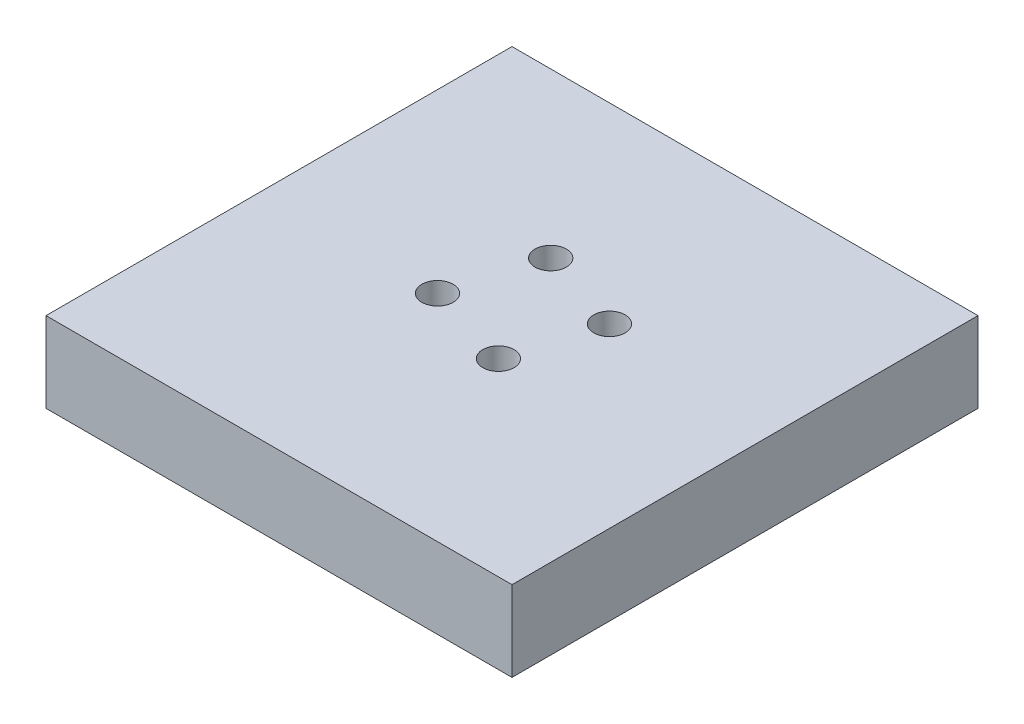
ISO-10303-21;
HEADER;
FILE_DESCRIPTION(('STEP AP214'),'2;1');
FILE_NAME('part.step','',(''),(''),'','','');
FILE_SCHEMA(('AUTOMOTIVE_DESIGN { 1 0 10303 214 1 1 1 1 }'));
ENDSEC;
DATA;
#1=APPLICATION_CONTEXT('core data for automotive mechanical design processes');
#2=APPLICATION_PROTOCOL_DEFINITION('international standard','automotive_design',2000,#1);
#3=PRODUCT_CONTEXT('',#1,'mechanical');
#4=PRODUCT('Part','Part','',(#3));
#5=PRODUCT_RELATED_PRODUCT_CATEGORY('part','',(#4));
#6=PRODUCT_DEFINITION_FORMATION('','',#4);
#7=PRODUCT_DEFINITION_CONTEXT('part definition',#1,'design');
#8=PRODUCT_DEFINITION('design','',#6,#7);
#9=PRODUCT_DEFINITION_SHAPE('','',#8);
#10=(LENGTH_UNIT() NAMED_UNIT(*) SI_UNIT(.MILLI.,.METRE.));
#11=(NAMED_UNIT(*) PLANE_ANGLE_UNIT() SI_UNIT($,.RADIAN.));
#12=(NAMED_UNIT(*) SI_UNIT($,.STERADIAN.) SOLID_ANGLE_UNIT());
#13=UNCERTAINTY_MEASURE_WITH_UNIT(LENGTH_MEASURE(1.E-05),#10,'distance_accuracy_value','');
#14=(GEOMETRIC_REPRESENTATION_CONTEXT(3) GLOBAL_UNCERTAINTY_ASSIGNED_CONTEXT((#13)) GLOBAL_UNIT_ASSIGNED_CONTEXT((#10,
#11,#12)) REPRESENTATION_CONTEXT('',''));
#15=CARTESIAN_POINT('',(0.,0.,0.));
#16=DIRECTION('',(0.,0.,1.));
#17=DIRECTION('',(1.,0.,0.));
#18=AXIS2_PLACEMENT_3D('',#15,#16,#17);
#19=CARTESIAN_POINT('',(29.,10.,29.));
#20=DIRECTION('',(-1.,0.,0.));
#21=DIRECTION('',(0.,0.,1.));
#22=AXIS2_PLACEMENT_3D('',#19,#20,#21);
#23=PLANE('',#22);
#24=DIRECTION('',(0.,0.,-1.));
#25=VECTOR('',#24,1.);
#26=CARTESIAN_POINT('',(29.,0.,29.));
#27=LINE('',#26,#25);
#28=CARTESIAN_POINT('',(29.,0.,29.));
#29=VERTEX_POINT('',#28);
#30=CARTESIAN_POINT('',(29.,0.,-29.));
#31=VERTEX_POINT('',#30);
#32=EDGE_CURVE('E98',#29,#31,#27,.T.);
#33=ORIENTED_EDGE('',*,*,#32,.T.);
#34=DIRECTION('',(0.,-1.,0.));
#35=VECTOR('',#34,1.);
#36=CARTESIAN_POINT('',(29.,10.,-29.));
#37=LINE('',#36,#35);
#38=CARTESIAN_POINT('',(29.,10.,-29.));
#39=VERTEX_POINT('',#38);
#40=EDGE_CURVE('E11',#39,#31,#37,.T.);
#41=ORIENTED_EDGE('',*,*,#40,.F.);
#42=DIRECTION('',(0.,0.,-1.));
#43=VECTOR('',#42,1.);
#44=CARTESIAN_POINT('',(29.,10.,29.));
#45=LINE('',#44,#43);
#46=CARTESIAN_POINT('',(29.,10.,29.));
#47=VERTEX_POINT('',#46);
#48=EDGE_CURVE('E86',#47,#39,#45,.T.);
#49=ORIENTED_EDGE('',*,*,#48,.F.);
#50=DIRECTION('',(0.,-1.,0.));
#51=VECTOR('',#50,1.);
#52=CARTESIAN_POINT('',(29.,10.,29.));
#53=LINE('',#52,#51);
#54=EDGE_CURVE('E94',#47,#29,#53,.T.);
#55=ORIENTED_EDGE('',*,*,#54,.T.);
#56=EDGE_LOOP('',(#33,#41,#49,#55));
#57=FACE_BOUND('',#56,.T.);
#58=ADVANCED_FACE('F35',(#57),#23,.F.);
#59=CARTESIAN_POINT('',(-29.,10.,-29.));
#60=DIRECTION('',(0.,0.,1.));
#61=DIRECTION('',(1.,0.,0.));
#62=AXIS2_PLACEMENT_3D('',#59,#60,#61);
#63=PLANE('',#62);
#64=DIRECTION('',(-1.,0.,0.));
#65=VECTOR('',#64,1.);
#66=CARTESIAN_POINT('',(-29.,0.,-29.));
#67=LINE('',#66,#65);
#68=CARTESIAN_POINT('',(-29.,0.,-29.));
#69=VERTEX_POINT('',#68);
#70=EDGE_CURVE('E90',#31,#69,#67,.T.);
#71=ORIENTED_EDGE('',*,*,#70,.T.);
#72=DIRECTION('',(0.,-1.,0.));
#73=VECTOR('',#72,1.);
#74=CARTESIAN_POINT('',(-29.,10.,-29.));
#75=LINE('',#74,#73);
#76=CARTESIAN_POINT('',(-29.,10.,-29.));
#77=VERTEX_POINT('',#76);
#78=EDGE_CURVE('E43',#77,#69,#75,.T.);
#79=ORIENTED_EDGE('',*,*,#78,.F.);
#80=DIRECTION('',(-1.,0.,0.));
#81=VECTOR('',#80,1.);
#82=CARTESIAN_POINT('',(-29.,10.,-29.));
#83=LINE('',#82,#81);
#84=EDGE_CURVE('E81',#39,#77,#83,.T.);
#85=ORIENTED_EDGE('',*,*,#84,.F.);
#86=ORIENTED_EDGE('',*,*,#40,.T.);
#87=EDGE_LOOP('',(#71,#79,#85,#86));
#88=FACE_BOUND('',#87,.T.);
#89=ADVANCED_FACE('F89',(#88),#63,.F.);
#90=CARTESIAN_POINT('',(-29.,10.,29.));
#91=DIRECTION('',(1.,0.,0.));
#92=DIRECTION('',(0.,0.,-1.));
#93=AXIS2_PLACEMENT_3D('',#90,#91,#92);
#94=PLANE('',#93);
#95=CARTESIAN_POINT('',(-29.,5.,0.));
#96=DIRECTION('',(-1.,0.,0.));
#97=DIRECTION('',(0.,0.,1.));
#98=AXIS2_PLACEMENT_3D('',#95,#96,#97);
#99=CIRCLE('',#98,2.5);
#100=CARTESIAN_POINT('',(-29.,5.,2.5));
#101=VERTEX_POINT('',#100);
#102=EDGE_CURVE('E112',#101,#101,#99,.T.);
#103=ORIENTED_EDGE('',*,*,#102,.F.);
#104=EDGE_LOOP('',(#103));
#105=FACE_BOUND('',#104,.T.);
#106=DIRECTION('',(0.,0.,1.));
#107=VECTOR('',#106,1.);
#108=CARTESIAN_POINT('',(-29.,0.,29.));
#109=LINE('',#108,#107);
#110=CARTESIAN_POINT('',(-29.,0.,29.));
#111=VERTEX_POINT('',#110);
#112=EDGE_CURVE('E68',#69,#111,#109,.T.);
#113=ORIENTED_EDGE('',*,*,#112,.T.);
#114=DIRECTION('',(0.,-1.,0.));
#115=VECTOR('',#114,1.);
#116=CARTESIAN_POINT('',(-29.,10.,29.));
#117=LINE('',#116,#115);
#118=CARTESIAN_POINT('',(-29.,10.,29.));
#119=VERTEX_POINT('',#118);
#120=EDGE_CURVE('E91',#119,#111,#117,.T.);
#121=ORIENTED_EDGE('',*,*,#120,.F.);
#122=DIRECTION('',(0.,0.,1.));
#123=VECTOR('',#122,1.);
#124=CARTESIAN_POINT('',(-29.,10.,29.));
#125=LINE('',#124,#123);
#126=EDGE_CURVE('E84',#77,#119,#125,.T.);
#127=ORIENTED_EDGE('',*,*,#126,.F.);
#128=ORIENTED_EDGE('',*,*,#78,.T.);
#129=EDGE_LOOP('',(#113,#121,#127,#128));
#130=FACE_BOUND('',#129,.T.);
#131=ADVANCED_FACE('F92',(#105,#130),#94,.F.);
#132=CARTESIAN_POINT('',(-29.,10.,29.));
#133=DIRECTION('',(0.,0.,-1.));
#134=DIRECTION('',(-1.,0.,0.));
#135=AXIS2_PLACEMENT_3D('',#132,#133,#134);
#136=PLANE('',#135);
#137=DIRECTION('',(1.,0.,0.));
#138=VECTOR('',#137,1.);
#139=CARTESIAN_POINT('',(-29.,0.,29.));
#140=LINE('',#139,#138);
#141=EDGE_CURVE('E74',#111,#29,#140,.T.);
#142=ORIENTED_EDGE('',*,*,#141,.T.);
#143=ORIENTED_EDGE('',*,*,#54,.F.);
#144=DIRECTION('',(1.,0.,0.));
#145=VECTOR('',#144,1.);
#146=CARTESIAN_POINT('',(-29.,10.,29.));
#147=LINE('',#146,#145);
#148=EDGE_CURVE('E51',#119,#47,#147,.T.);
#149=ORIENTED_EDGE('',*,*,#148,.F.);
#150=ORIENTED_EDGE('',*,*,#120,.T.);
#151=EDGE_LOOP('',(#142,#143,#149,#150));
#152=FACE_BOUND('',#151,.T.);
#153=ADVANCED_FACE('F106',(#152),#136,.F.);
#154=CARTESIAN_POINT('',(0.,10.,0.));
#155=DIRECTION('',(0.,-1.,0.));
#156=DIRECTION('',(0.,0.,-1.));
#157=AXIS2_PLACEMENT_3D('',#154,#155,#156);
#158=PLANE('',#157);
#159=CARTESIAN_POINT('',(6.95518451110358,10.,-5.1759612471052));
#160=DIRECTION('',(0.,1.,0.));
#161=DIRECTION('',(0.,0.,1.));
#162=AXIS2_PLACEMENT_3D('',#159,#160,#161);
#163=CIRCLE('',#162,1.95);
#164=CARTESIAN_POINT('',(6.95518451110358,10.,-3.2259612471052));
#165=VERTEX_POINT('',#164);
#166=EDGE_CURVE('E131',#165,#165,#163,.T.);
#167=ORIENTED_EDGE('',*,*,#166,.F.);
#168=EDGE_LOOP('',(#167));
#169=FACE_BOUND('',#168,.T.);
#170=CARTESIAN_POINT('',(-7.04447524786959,10.,2.22990228623448));
#171=DIRECTION('',(0.,1.,0.));
#172=DIRECTION('',(0.,0.,1.));
#173=AXIS2_PLACEMENT_3D('',#170,#171,#172);
#174=CIRCLE('',#173,1.95);
#175=CARTESIAN_POINT('',(-7.04447524786959,10.,4.17990228623448));
#176=VERTEX_POINT('',#175);
#177=EDGE_CURVE('E124',#176,#176,#174,.T.);
#178=ORIENTED_EDGE('',*,*,#177,.F.);
#179=EDGE_LOOP('',(#178));
#180=FACE_BOUND('',#179,.T.);
#181=CARTESIAN_POINT('',(3.79148631570163,10.,5.48289121840242));
#182=DIRECTION('',(0.,1.,0.));
#183=DIRECTION('',(0.,0.,1.));
#184=AXIS2_PLACEMENT_3D('',#181,#182,#183);
#185=CIRCLE('',#184,1.95);
#186=CARTESIAN_POINT('',(3.79148631570163,10.,7.43289121840242));
#187=VERTEX_POINT('',#186);
#188=EDGE_CURVE('E136',#187,#187,#185,.T.);
#189=ORIENTED_EDGE('',*,*,#188,.F.);
#190=EDGE_LOOP('',(#189));
#191=FACE_BOUND('',#190,.T.);
#192=CARTESIAN_POINT('',(-3.79148631570165,10.,-8.60605927733674));
#193=DIRECTION('',(0.,1.,0.));
#194=DIRECTION('',(0.,0.,1.));
#195=AXIS2_PLACEMENT_3D('',#192,#193,#194);
#196=CIRCLE('',#195,1.95);
#197=CARTESIAN_POINT('',(-3.79148631570165,10.,-6.65605927733674));
#198=VERTEX_POINT('',#197);
#199=EDGE_CURVE('E118',#198,#198,#196,.T.);
#200=ORIENTED_EDGE('',*,*,#199,.F.);
#201=EDGE_LOOP('',(#200));
#202=FACE_BOUND('',#201,.T.);
#203=ORIENTED_EDGE('',*,*,#48,.T.);
#204=ORIENTED_EDGE('',*,*,#84,.T.);
#205=ORIENTED_EDGE('',*,*,#126,.T.);
#206=ORIENTED_EDGE('',*,*,#148,.T.);
#207=EDGE_LOOP('',(#203,#204,#205,#206));
#208=FACE_BOUND('',#207,.T.);
#209=ADVANCED_FACE('F82',(#169,#180,#191,#202,#208),#158,.F.);
#210=CARTESIAN_POINT('',(0.,0.,0.));
#211=DIRECTION('',(0.,-1.,0.));
#212=DIRECTION('',(0.,0.,-1.));
#213=AXIS2_PLACEMENT_3D('',#210,#211,#212);
#214=PLANE('',#213);
#215=CARTESIAN_POINT('',(6.95518451110358,0.,-5.1759612471052));
#216=DIRECTION('',(0.,1.,0.));
#217=DIRECTION('',(0.,0.,1.));
#218=AXIS2_PLACEMENT_3D('',#215,#216,#217);
#219=CIRCLE('',#218,1.95);
#220=CARTESIAN_POINT('',(6.95518451110358,0.,-3.2259612471052));
#221=VERTEX_POINT('',#220);
#222=EDGE_CURVE('E121',#221,#221,#219,.T.);
#223=ORIENTED_EDGE('',*,*,#222,.T.);
#224=EDGE_LOOP('',(#223));
#225=FACE_BOUND('',#224,.T.);
#226=CARTESIAN_POINT('',(-7.04447524786959,0.,2.22990228623448));
#227=DIRECTION('',(0.,1.,0.));
#228=DIRECTION('',(0.,0.,1.));
#229=AXIS2_PLACEMENT_3D('',#226,#227,#228);
#230=CIRCLE('',#229,1.95);
#231=CARTESIAN_POINT('',(-7.04447524786959,0.,4.17990228623448));
#232=VERTEX_POINT('',#231);
#233=EDGE_CURVE('E127',#232,#232,#230,.T.);
#234=ORIENTED_EDGE('',*,*,#233,.T.);
#235=EDGE_LOOP('',(#234));
#236=FACE_BOUND('',#235,.T.);
#237=CARTESIAN_POINT('',(3.79148631570163,0.,5.48289121840242));
#238=DIRECTION('',(0.,1.,0.));
#239=DIRECTION('',(0.,0.,1.));
#240=AXIS2_PLACEMENT_3D('',#237,#238,#239);
#241=CIRCLE('',#240,1.95);
#242=CARTESIAN_POINT('',(3.79148631570163,0.,7.43289121840242));
#243=VERTEX_POINT('',#242);
#244=EDGE_CURVE('E128',#243,#243,#241,.T.);
#245=ORIENTED_EDGE('',*,*,#244,.T.);
#246=EDGE_LOOP('',(#245));
#247=FACE_BOUND('',#246,.T.);
#248=CARTESIAN_POINT('',(-3.79148631570165,0.,-8.60605927733674));
#249=DIRECTION('',(0.,1.,0.));
#250=DIRECTION('',(0.,0.,1.));
#251=AXIS2_PLACEMENT_3D('',#248,#249,#250);
#252=CIRCLE('',#251,1.95);
#253=CARTESIAN_POINT('',(-3.79148631570165,0.,-6.65605927733674));
#254=VERTEX_POINT('',#253);
#255=EDGE_CURVE('E115',#254,#254,#252,.T.);
#256=ORIENTED_EDGE('',*,*,#255,.T.);
#257=EDGE_LOOP('',(#256));
#258=FACE_BOUND('',#257,.T.);
#259=ORIENTED_EDGE('',*,*,#32,.F.);
#260=ORIENTED_EDGE('',*,*,#141,.F.);
#261=ORIENTED_EDGE('',*,*,#112,.F.);
#262=ORIENTED_EDGE('',*,*,#70,.F.);
#263=EDGE_LOOP('',(#259,#260,#261,#262));
#264=FACE_BOUND('',#263,.T.);
#265=ADVANCED_FACE('F109',(#225,#236,#247,#258,#264),#214,.T.);
#266=CARTESIAN_POINT('',(-19.,5.,0.));
#267=DIRECTION('',(-1.,0.,0.));
#268=DIRECTION('',(0.,0.,1.));
#269=AXIS2_PLACEMENT_3D('',#266,#267,#268);
#270=CYLINDRICAL_SURFACE('',#269,2.5);
#271=CARTESIAN_POINT('',(-19.,5.,0.));
#272=DIRECTION('',(-1.,0.,0.));
#273=DIRECTION('',(0.,0.,1.));
#274=AXIS2_PLACEMENT_3D('',#271,#272,#273);
#275=CIRCLE('',#274,2.5);
#276=CARTESIAN_POINT('',(-19.,5.,2.5));
#277=VERTEX_POINT('',#276);
#278=EDGE_CURVE('E101',#277,#277,#275,.T.);
#279=ORIENTED_EDGE('',*,*,#278,.F.);
#280=EDGE_LOOP('',(#279));
#281=FACE_BOUND('',#280,.T.);
#282=ORIENTED_EDGE('',*,*,#102,.T.);
#283=EDGE_LOOP('',(#282));
#284=FACE_BOUND('',#283,.T.);
#285=ADVANCED_FACE('F165',(#281,#284),#270,.F.);
#286=CARTESIAN_POINT('',(-19.,5.,0.));
#287=DIRECTION('',(-1.,0.,0.));
#288=DIRECTION('',(0.,0.,1.));
#289=AXIS2_PLACEMENT_3D('',#286,#287,#288);
#290=PLANE('',#289);
#291=ORIENTED_EDGE('',*,*,#278,.T.);
#292=EDGE_LOOP('',(#291));
#293=FACE_BOUND('',#292,.T.);
#294=ADVANCED_FACE('F159',(#293),#290,.T.);
#295=CARTESIAN_POINT('',(-3.79148631570165,0.,-8.60605927733674));
#296=DIRECTION('',(0.,1.,0.));
#297=DIRECTION('',(0.,0.,1.));
#298=AXIS2_PLACEMENT_3D('',#295,#296,#297);
#299=CYLINDRICAL_SURFACE('',#298,1.95);
#300=ORIENTED_EDGE('',*,*,#255,.F.);
#301=EDGE_LOOP('',(#300));
#302=FACE_BOUND('',#301,.T.);
#303=ORIENTED_EDGE('',*,*,#199,.T.);
#304=EDGE_LOOP('',(#303));
#305=FACE_BOUND('',#304,.T.);
#306=ADVANCED_FACE('F148',(#302,#305),#299,.F.);
#307=CARTESIAN_POINT('',(3.79148631570163,0.,5.48289121840242));
#308=DIRECTION('',(0.,1.,0.));
#309=DIRECTION('',(0.,0.,1.));
#310=AXIS2_PLACEMENT_3D('',#307,#308,#309);
#311=CYLINDRICAL_SURFACE('',#310,1.95);
#312=ORIENTED_EDGE('',*,*,#244,.F.);
#313=EDGE_LOOP('',(#312));
#314=FACE_BOUND('',#313,.T.);
#315=ORIENTED_EDGE('',*,*,#188,.T.);
#316=EDGE_LOOP('',(#315));
#317=FACE_BOUND('',#316,.T.);
#318=ADVANCED_FACE('F144',(#314,#317),#311,.F.);
#319=CARTESIAN_POINT('',(-7.04447524786959,0.,2.22990228623448));
#320=DIRECTION('',(0.,1.,0.));
#321=DIRECTION('',(0.,0.,1.));
#322=AXIS2_PLACEMENT_3D('',#319,#320,#321);
#323=CYLINDRICAL_SURFACE('',#322,1.95);
#324=ORIENTED_EDGE('',*,*,#233,.F.);
#325=EDGE_LOOP('',(#324));
#326=FACE_BOUND('',#325,.T.);
#327=ORIENTED_EDGE('',*,*,#177,.T.);
#328=EDGE_LOOP('',(#327));
#329=FACE_BOUND('',#328,.T.);
#330=ADVANCED_FACE('F147',(#326,#329),#323,.F.);
#331=CARTESIAN_POINT('',(6.95518451110358,0.,-5.1759612471052));
#332=DIRECTION('',(0.,1.,0.));
#333=DIRECTION('',(0.,0.,1.));
#334=AXIS2_PLACEMENT_3D('',#331,#332,#333);
#335=CYLINDRICAL_SURFACE('',#334,1.95);
#336=ORIENTED_EDGE('',*,*,#222,.F.);
#337=EDGE_LOOP('',(#336));
#338=FACE_BOUND('',#337,.T.);
#339=ORIENTED_EDGE('',*,*,#166,.T.);
#340=EDGE_LOOP('',(#339));
#341=FACE_BOUND('',#340,.T.);
#342=ADVANCED_FACE('F229',(#338,#341),#335,.F.);
#343=CLOSED_SHELL('',(#58,#89,#131,#153,#209,#265,#285,#294,#306,#318,#330,#342));
#344=MANIFOLD_SOLID_BREP('B2',#343);
#345=ADVANCED_BREP_SHAPE_REPRESENTATION('',(#18,#344),#14);
#346=SHAPE_DEFINITION_REPRESENTATION(#9,#345);
ENDSEC;
END-ISO-10303-21;
